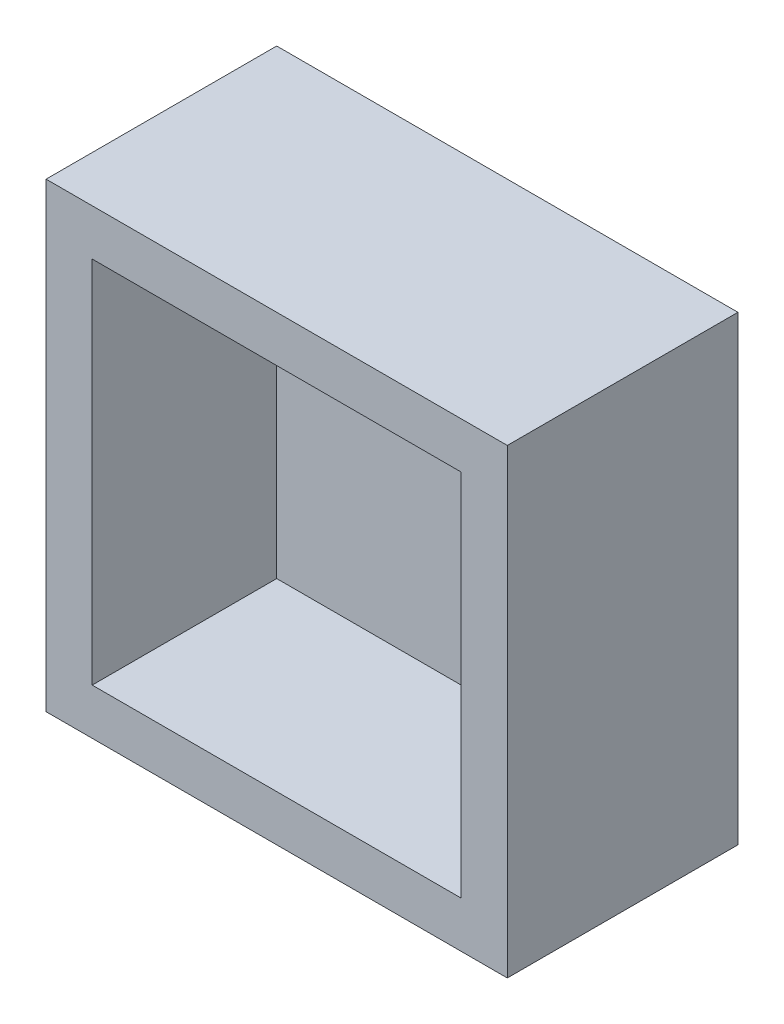
ISO-10303-21;
HEADER;
FILE_DESCRIPTION(('STEP AP214'),'2;1');
FILE_NAME('part.step','',(''),(''),'','','');
FILE_SCHEMA(('AUTOMOTIVE_DESIGN { 1 0 10303 214 1 1 1 1 }'));
ENDSEC;
DATA;
#1=APPLICATION_CONTEXT('core data for automotive mechanical design processes');
#2=APPLICATION_PROTOCOL_DEFINITION('international standard','automotive_design',2000,#1);
#3=PRODUCT_CONTEXT('',#1,'mechanical');
#4=PRODUCT('Part','Part','',(#3));
#5=PRODUCT_RELATED_PRODUCT_CATEGORY('part','',(#4));
#6=PRODUCT_DEFINITION_FORMATION('','',#4);
#7=PRODUCT_DEFINITION_CONTEXT('part definition',#1,'design');
#8=PRODUCT_DEFINITION('design','',#6,#7);
#9=PRODUCT_DEFINITION_SHAPE('','',#8);
#10=(LENGTH_UNIT() NAMED_UNIT(*) SI_UNIT(.MILLI.,.METRE.));
#11=(NAMED_UNIT(*) PLANE_ANGLE_UNIT() SI_UNIT($,.RADIAN.));
#12=(NAMED_UNIT(*) SI_UNIT($,.STERADIAN.) SOLID_ANGLE_UNIT());
#13=UNCERTAINTY_MEASURE_WITH_UNIT(LENGTH_MEASURE(1.E-05),#10,'distance_accuracy_value','');
#14=(GEOMETRIC_REPRESENTATION_CONTEXT(3) GLOBAL_UNCERTAINTY_ASSIGNED_CONTEXT((#13)) GLOBAL_UNIT_ASSIGNED_CONTEXT((#10,
#11,#12)) REPRESENTATION_CONTEXT('',''));
#15=CARTESIAN_POINT('',(0.,0.,0.));
#16=DIRECTION('',(0.,0.,1.));
#17=DIRECTION('',(1.,0.,0.));
#18=AXIS2_PLACEMENT_3D('',#15,#16,#17);
#19=CARTESIAN_POINT('',(0.,0.,10.));
#20=DIRECTION('',(0.,0.,-1.));
#21=DIRECTION('',(-1.,0.,0.));
#22=AXIS2_PLACEMENT_3D('',#19,#20,#21);
#23=PLANE('',#22);
#24=DIRECTION('',(0.,-1.,0.));
#25=VECTOR('',#24,1.);
#26=CARTESIAN_POINT('',(0.,0.,10.));
#27=LINE('',#26,#25);
#28=CARTESIAN_POINT('',(0.,20.,10.));
#29=VERTEX_POINT('',#28);
#30=CARTESIAN_POINT('',(0.,0.,10.));
#31=VERTEX_POINT('',#30);
#32=EDGE_CURVE('E151',#29,#31,#27,.T.);
#33=ORIENTED_EDGE('',*,*,#32,.T.);
#34=DIRECTION('',(1.,0.,0.));
#35=VECTOR('',#34,1.);
#36=CARTESIAN_POINT('',(0.,0.,10.));
#37=LINE('',#36,#35);
#38=CARTESIAN_POINT('',(20.,0.,10.));
#39=VERTEX_POINT('',#38);
#40=EDGE_CURVE('E92',#31,#39,#37,.T.);
#41=ORIENTED_EDGE('',*,*,#40,.T.);
#42=DIRECTION('',(0.,1.,0.));
#43=VECTOR('',#42,1.);
#44=CARTESIAN_POINT('',(20.,0.,10.));
#45=LINE('',#44,#43);
#46=CARTESIAN_POINT('',(20.,20.,10.));
#47=VERTEX_POINT('',#46);
#48=EDGE_CURVE('E152',#39,#47,#45,.T.);
#49=ORIENTED_EDGE('',*,*,#48,.T.);
#50=DIRECTION('',(-1.,0.,0.));
#51=VECTOR('',#50,1.);
#52=CARTESIAN_POINT('',(0.,20.,10.));
#53=LINE('',#52,#51);
#54=EDGE_CURVE('E67',#47,#29,#53,.T.);
#55=ORIENTED_EDGE('',*,*,#54,.T.);
#56=EDGE_LOOP('',(#33,#41,#49,#55));
#57=FACE_BOUND('',#56,.T.);
#58=DIRECTION('',(0.,-1.,0.));
#59=VECTOR('',#58,1.);
#60=CARTESIAN_POINT('',(2.,0.,10.));
#61=LINE('',#60,#59);
#62=CARTESIAN_POINT('',(2.,18.,10.));
#63=VERTEX_POINT('',#62);
#64=CARTESIAN_POINT('',(2.,2.,10.));
#65=VERTEX_POINT('',#64);
#66=EDGE_CURVE('E140',#63,#65,#61,.T.);
#67=ORIENTED_EDGE('',*,*,#66,.F.);
#68=DIRECTION('',(-1.,0.,0.));
#69=VECTOR('',#68,1.);
#70=CARTESIAN_POINT('',(0.,18.,10.));
#71=LINE('',#70,#69);
#72=CARTESIAN_POINT('',(18.,18.,10.));
#73=VERTEX_POINT('',#72);
#74=EDGE_CURVE('E149',#73,#63,#71,.T.);
#75=ORIENTED_EDGE('',*,*,#74,.F.);
#76=DIRECTION('',(0.,1.,0.));
#77=VECTOR('',#76,1.);
#78=CARTESIAN_POINT('',(18.,0.,10.));
#79=LINE('',#78,#77);
#80=CARTESIAN_POINT('',(18.,2.,10.));
#81=VERTEX_POINT('',#80);
#82=EDGE_CURVE('E150',#81,#73,#79,.T.);
#83=ORIENTED_EDGE('',*,*,#82,.F.);
#84=DIRECTION('',(1.,0.,0.));
#85=VECTOR('',#84,1.);
#86=CARTESIAN_POINT('',(0.,2.,10.));
#87=LINE('',#86,#85);
#88=EDGE_CURVE('E134',#65,#81,#87,.T.);
#89=ORIENTED_EDGE('',*,*,#88,.F.);
#90=EDGE_LOOP('',(#67,#75,#83,#89));
#91=FACE_BOUND('',#90,.T.);
#92=ADVANCED_FACE('F43',(#57,#91),#23,.F.);
#93=CARTESIAN_POINT('',(0.,0.,10.));
#94=DIRECTION('',(1.,0.,0.));
#95=DIRECTION('',(0.,0.,-1.));
#96=AXIS2_PLACEMENT_3D('',#93,#94,#95);
#97=PLANE('',#96);
#98=DIRECTION('',(0.,-1.,0.));
#99=VECTOR('',#98,1.);
#100=CARTESIAN_POINT('',(0.,0.,0.));
#101=LINE('',#100,#99);
#102=CARTESIAN_POINT('',(0.,20.,0.));
#103=VERTEX_POINT('',#102);
#104=CARTESIAN_POINT('',(0.,0.,0.));
#105=VERTEX_POINT('',#104);
#106=EDGE_CURVE('E158',#103,#105,#101,.T.);
#107=ORIENTED_EDGE('',*,*,#106,.T.);
#108=DIRECTION('',(0.,0.,-1.));
#109=VECTOR('',#108,1.);
#110=CARTESIAN_POINT('',(0.,0.,10.));
#111=LINE('',#110,#109);
#112=EDGE_CURVE('E11',#31,#105,#111,.T.);
#113=ORIENTED_EDGE('',*,*,#112,.F.);
#114=ORIENTED_EDGE('',*,*,#32,.F.);
#115=DIRECTION('',(0.,0.,-1.));
#116=VECTOR('',#115,1.);
#117=CARTESIAN_POINT('',(0.,20.,10.));
#118=LINE('',#117,#116);
#119=EDGE_CURVE('E160',#29,#103,#118,.T.);
#120=ORIENTED_EDGE('',*,*,#119,.T.);
#121=EDGE_LOOP('',(#107,#113,#114,#120));
#122=FACE_BOUND('',#121,.T.);
#123=ADVANCED_FACE('F44',(#122),#97,.F.);
#124=CARTESIAN_POINT('',(0.,0.,10.));
#125=DIRECTION('',(0.,1.,0.));
#126=DIRECTION('',(0.,0.,1.));
#127=AXIS2_PLACEMENT_3D('',#124,#125,#126);
#128=PLANE('',#127);
#129=DIRECTION('',(1.,0.,0.));
#130=VECTOR('',#129,1.);
#131=CARTESIAN_POINT('',(0.,0.,0.));
#132=LINE('',#131,#130);
#133=CARTESIAN_POINT('',(20.,0.,0.));
#134=VERTEX_POINT('',#133);
#135=EDGE_CURVE('E161',#105,#134,#132,.T.);
#136=ORIENTED_EDGE('',*,*,#135,.T.);
#137=DIRECTION('',(0.,0.,-1.));
#138=VECTOR('',#137,1.);
#139=CARTESIAN_POINT('',(20.,0.,10.));
#140=LINE('',#139,#138);
#141=EDGE_CURVE('E51',#39,#134,#140,.T.);
#142=ORIENTED_EDGE('',*,*,#141,.F.);
#143=ORIENTED_EDGE('',*,*,#40,.F.);
#144=ORIENTED_EDGE('',*,*,#112,.T.);
#145=EDGE_LOOP('',(#136,#142,#143,#144));
#146=FACE_BOUND('',#145,.T.);
#147=ADVANCED_FACE('F190',(#146),#128,.F.);
#148=CARTESIAN_POINT('',(20.,0.,10.));
#149=DIRECTION('',(-1.,0.,0.));
#150=DIRECTION('',(0.,0.,1.));
#151=AXIS2_PLACEMENT_3D('',#148,#149,#150);
#152=PLANE('',#151);
#153=DIRECTION('',(0.,1.,0.));
#154=VECTOR('',#153,1.);
#155=CARTESIAN_POINT('',(20.,0.,0.));
#156=LINE('',#155,#154);
#157=CARTESIAN_POINT('',(20.,20.,0.));
#158=VERTEX_POINT('',#157);
#159=EDGE_CURVE('E162',#134,#158,#156,.T.);
#160=ORIENTED_EDGE('',*,*,#159,.T.);
#161=DIRECTION('',(0.,0.,-1.));
#162=VECTOR('',#161,1.);
#163=CARTESIAN_POINT('',(20.,20.,10.));
#164=LINE('',#163,#162);
#165=EDGE_CURVE('E170',#47,#158,#164,.T.);
#166=ORIENTED_EDGE('',*,*,#165,.F.);
#167=ORIENTED_EDGE('',*,*,#48,.F.);
#168=ORIENTED_EDGE('',*,*,#141,.T.);
#169=EDGE_LOOP('',(#160,#166,#167,#168));
#170=FACE_BOUND('',#169,.T.);
#171=ADVANCED_FACE('F174',(#170),#152,.F.);
#172=CARTESIAN_POINT('',(0.,20.,10.));
#173=DIRECTION('',(0.,-1.,0.));
#174=DIRECTION('',(0.,0.,-1.));
#175=AXIS2_PLACEMENT_3D('',#172,#173,#174);
#176=PLANE('',#175);
#177=DIRECTION('',(-1.,0.,0.));
#178=VECTOR('',#177,1.);
#179=CARTESIAN_POINT('',(0.,20.,0.));
#180=LINE('',#179,#178);
#181=EDGE_CURVE('E86',#158,#103,#180,.T.);
#182=ORIENTED_EDGE('',*,*,#181,.T.);
#183=ORIENTED_EDGE('',*,*,#119,.F.);
#184=ORIENTED_EDGE('',*,*,#54,.F.);
#185=ORIENTED_EDGE('',*,*,#165,.T.);
#186=EDGE_LOOP('',(#182,#183,#184,#185));
#187=FACE_BOUND('',#186,.T.);
#188=ADVANCED_FACE('F180',(#187),#176,.F.);
#189=CARTESIAN_POINT('',(0.,0.,0.));
#190=DIRECTION('',(0.,0.,-1.));
#191=DIRECTION('',(-1.,0.,0.));
#192=AXIS2_PLACEMENT_3D('',#189,#190,#191);
#193=PLANE('',#192);
#194=ORIENTED_EDGE('',*,*,#106,.F.);
#195=ORIENTED_EDGE('',*,*,#181,.F.);
#196=ORIENTED_EDGE('',*,*,#159,.F.);
#197=ORIENTED_EDGE('',*,*,#135,.F.);
#198=EDGE_LOOP('',(#194,#195,#196,#197));
#199=FACE_BOUND('',#198,.T.);
#200=ADVANCED_FACE('F176',(#199),#193,.T.);
#201=CARTESIAN_POINT('',(2.,0.,10.));
#202=DIRECTION('',(1.,0.,0.));
#203=DIRECTION('',(0.,0.,-1.));
#204=AXIS2_PLACEMENT_3D('',#201,#202,#203);
#205=PLANE('',#204);
#206=DIRECTION('',(0.,-1.,0.));
#207=VECTOR('',#206,1.);
#208=CARTESIAN_POINT('',(2.,0.,2.));
#209=LINE('',#208,#207);
#210=CARTESIAN_POINT('',(2.,18.,2.));
#211=VERTEX_POINT('',#210);
#212=CARTESIAN_POINT('',(2.,2.,2.));
#213=VERTEX_POINT('',#212);
#214=EDGE_CURVE('E124',#211,#213,#209,.T.);
#215=ORIENTED_EDGE('',*,*,#214,.F.);
#216=DIRECTION('',(0.,0.,-1.));
#217=VECTOR('',#216,1.);
#218=CARTESIAN_POINT('',(2.,18.,10.));
#219=LINE('',#218,#217);
#220=EDGE_CURVE('E141',#63,#211,#219,.T.);
#221=ORIENTED_EDGE('',*,*,#220,.F.);
#222=ORIENTED_EDGE('',*,*,#66,.T.);
#223=DIRECTION('',(0.,0.,-1.));
#224=VECTOR('',#223,1.);
#225=CARTESIAN_POINT('',(2.,2.,10.));
#226=LINE('',#225,#224);
#227=EDGE_CURVE('E131',#65,#213,#226,.T.);
#228=ORIENTED_EDGE('',*,*,#227,.T.);
#229=EDGE_LOOP('',(#215,#221,#222,#228));
#230=FACE_BOUND('',#229,.T.);
#231=ADVANCED_FACE('F189',(#230),#205,.T.);
#232=CARTESIAN_POINT('',(0.,2.,10.));
#233=DIRECTION('',(0.,1.,0.));
#234=DIRECTION('',(0.,0.,1.));
#235=AXIS2_PLACEMENT_3D('',#232,#233,#234);
#236=PLANE('',#235);
#237=DIRECTION('',(1.,0.,0.));
#238=VECTOR('',#237,1.);
#239=CARTESIAN_POINT('',(0.,2.,2.));
#240=LINE('',#239,#238);
#241=CARTESIAN_POINT('',(18.,2.,2.));
#242=VERTEX_POINT('',#241);
#243=EDGE_CURVE('E119',#213,#242,#240,.T.);
#244=ORIENTED_EDGE('',*,*,#243,.F.);
#245=ORIENTED_EDGE('',*,*,#227,.F.);
#246=ORIENTED_EDGE('',*,*,#88,.T.);
#247=DIRECTION('',(0.,0.,-1.));
#248=VECTOR('',#247,1.);
#249=CARTESIAN_POINT('',(18.,2.,10.));
#250=LINE('',#249,#248);
#251=EDGE_CURVE('E129',#81,#242,#250,.T.);
#252=ORIENTED_EDGE('',*,*,#251,.T.);
#253=EDGE_LOOP('',(#244,#245,#246,#252));
#254=FACE_BOUND('',#253,.T.);
#255=ADVANCED_FACE('F128',(#254),#236,.T.);
#256=CARTESIAN_POINT('',(18.,0.,10.));
#257=DIRECTION('',(-1.,0.,0.));
#258=DIRECTION('',(0.,0.,1.));
#259=AXIS2_PLACEMENT_3D('',#256,#257,#258);
#260=PLANE('',#259);
#261=DIRECTION('',(0.,1.,0.));
#262=VECTOR('',#261,1.);
#263=CARTESIAN_POINT('',(18.,0.,2.));
#264=LINE('',#263,#262);
#265=CARTESIAN_POINT('',(18.,18.,2.));
#266=VERTEX_POINT('',#265);
#267=EDGE_CURVE('E121',#242,#266,#264,.T.);
#268=ORIENTED_EDGE('',*,*,#267,.F.);
#269=ORIENTED_EDGE('',*,*,#251,.F.);
#270=ORIENTED_EDGE('',*,*,#82,.T.);
#271=DIRECTION('',(0.,0.,-1.));
#272=VECTOR('',#271,1.);
#273=CARTESIAN_POINT('',(18.,18.,10.));
#274=LINE('',#273,#272);
#275=EDGE_CURVE('E59',#73,#266,#274,.T.);
#276=ORIENTED_EDGE('',*,*,#275,.T.);
#277=EDGE_LOOP('',(#268,#269,#270,#276));
#278=FACE_BOUND('',#277,.T.);
#279=ADVANCED_FACE('F137',(#278),#260,.T.);
#280=CARTESIAN_POINT('',(0.,18.,10.));
#281=DIRECTION('',(0.,-1.,0.));
#282=DIRECTION('',(0.,0.,-1.));
#283=AXIS2_PLACEMENT_3D('',#280,#281,#282);
#284=PLANE('',#283);
#285=DIRECTION('',(-1.,0.,0.));
#286=VECTOR('',#285,1.);
#287=CARTESIAN_POINT('',(0.,18.,2.));
#288=LINE('',#287,#286);
#289=EDGE_CURVE('E139',#266,#211,#288,.T.);
#290=ORIENTED_EDGE('',*,*,#289,.F.);
#291=ORIENTED_EDGE('',*,*,#275,.F.);
#292=ORIENTED_EDGE('',*,*,#74,.T.);
#293=ORIENTED_EDGE('',*,*,#220,.T.);
#294=EDGE_LOOP('',(#290,#291,#292,#293));
#295=FACE_BOUND('',#294,.T.);
#296=ADVANCED_FACE('F203',(#295),#284,.T.);
#297=CARTESIAN_POINT('',(0.,0.,2.));
#298=DIRECTION('',(0.,0.,-1.));
#299=DIRECTION('',(-1.,0.,0.));
#300=AXIS2_PLACEMENT_3D('',#297,#298,#299);
#301=PLANE('',#300);
#302=ORIENTED_EDGE('',*,*,#214,.T.);
#303=ORIENTED_EDGE('',*,*,#243,.T.);
#304=ORIENTED_EDGE('',*,*,#267,.T.);
#305=ORIENTED_EDGE('',*,*,#289,.T.);
#306=EDGE_LOOP('',(#302,#303,#304,#305));
#307=FACE_BOUND('',#306,.T.);
#308=ADVANCED_FACE('F120',(#307),#301,.F.);
#309=CLOSED_SHELL('',(#92,#123,#147,#171,#188,#200,#231,#255,#279,#296,#308));
#310=MANIFOLD_SOLID_BREP('B2',#309);
#311=ADVANCED_BREP_SHAPE_REPRESENTATION('',(#18,#310),#14);
#312=SHAPE_DEFINITION_REPRESENTATION(#9,#311);
ENDSEC;
END-ISO-10303-21;
